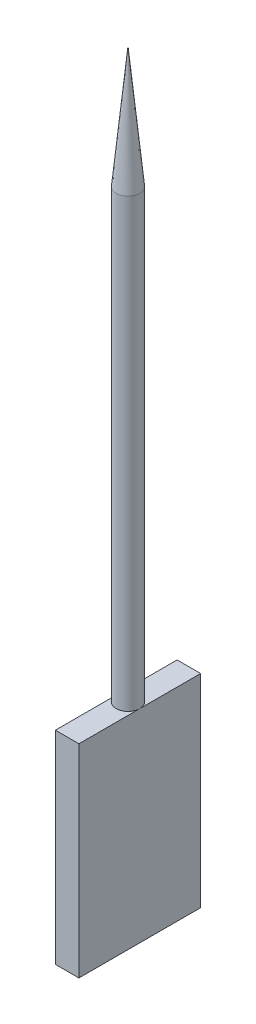
ISO-10303-21;
HEADER;
FILE_DESCRIPTION(('STEP AP214'),'2;1');
FILE_NAME('part.step','',(''),(''),'','','');
FILE_SCHEMA(('AUTOMOTIVE_DESIGN { 1 0 10303 214 1 1 1 1 }'));
ENDSEC;
DATA;
#1=APPLICATION_CONTEXT('core data for automotive mechanical design processes');
#2=APPLICATION_PROTOCOL_DEFINITION('international standard','automotive_design',2000,#1);
#3=PRODUCT_CONTEXT('',#1,'mechanical');
#4=PRODUCT('Part','Part','',(#3));
#5=PRODUCT_RELATED_PRODUCT_CATEGORY('part','',(#4));
#6=PRODUCT_DEFINITION_FORMATION('','',#4);
#7=PRODUCT_DEFINITION_CONTEXT('part definition',#1,'design');
#8=PRODUCT_DEFINITION('design','',#6,#7);
#9=PRODUCT_DEFINITION_SHAPE('','',#8);
#10=(LENGTH_UNIT() NAMED_UNIT(*) SI_UNIT(.MILLI.,.METRE.));
#11=(NAMED_UNIT(*) PLANE_ANGLE_UNIT() SI_UNIT($,.RADIAN.));
#12=(NAMED_UNIT(*) SI_UNIT($,.STERADIAN.) SOLID_ANGLE_UNIT());
#13=UNCERTAINTY_MEASURE_WITH_UNIT(LENGTH_MEASURE(1.E-05),#10,'distance_accuracy_value','');
#14=(GEOMETRIC_REPRESENTATION_CONTEXT(3) GLOBAL_UNCERTAINTY_ASSIGNED_CONTEXT((#13)) GLOBAL_UNIT_ASSIGNED_CONTEXT((#10,
#11,#12)) REPRESENTATION_CONTEXT('',''));
#15=CARTESIAN_POINT('',(0.,0.,0.));
#16=DIRECTION('',(0.,0.,1.));
#17=DIRECTION('',(1.,0.,0.));
#18=AXIS2_PLACEMENT_3D('',#15,#16,#17);
#19=CARTESIAN_POINT('',(-1.45,80.,7.5));
#20=DIRECTION('',(1.,0.,0.));
#21=DIRECTION('',(0.,0.,-1.));
#22=AXIS2_PLACEMENT_3D('',#19,#20,#21);
#23=PLANE('',#22);
#24=DIRECTION('',(0.,0.,-1.));
#25=VECTOR('',#24,1.);
#26=CARTESIAN_POINT('',(-1.45,25.,7.5));
#27=LINE('',#26,#25);
#28=CARTESIAN_POINT('',(-1.45000000000001,25.,7.5));
#29=VERTEX_POINT('',#28);
#30=CARTESIAN_POINT('',(-1.45,25.,0.));
#31=VERTEX_POINT('',#30);
#32=EDGE_CURVE('E133',#29,#31,#27,.T.);
#33=ORIENTED_EDGE('',*,*,#32,.T.);
#34=DIRECTION('',(0.,0.,-1.));
#35=VECTOR('',#34,1.);
#36=CARTESIAN_POINT('',(-1.45,25.,7.49999999999997));
#37=LINE('',#36,#35);
#38=CARTESIAN_POINT('',(-1.45000000000001,25.,-7.50000000000001));
#39=VERTEX_POINT('',#38);
#40=EDGE_CURVE('E12',#31,#39,#37,.T.);
#41=ORIENTED_EDGE('',*,*,#40,.T.);
#42=DIRECTION('',(0.,-1.,0.));
#43=VECTOR('',#42,1.);
#44=CARTESIAN_POINT('',(-1.45,80.,-7.5));
#45=LINE('',#44,#43);
#46=CARTESIAN_POINT('',(-1.45,0.,-7.5));
#47=VERTEX_POINT('',#46);
#48=EDGE_CURVE('E116',#39,#47,#45,.T.);
#49=ORIENTED_EDGE('',*,*,#48,.T.);
#50=DIRECTION('',(0.,0.,1.));
#51=VECTOR('',#50,1.);
#52=CARTESIAN_POINT('',(-1.45,0.,7.5));
#53=LINE('',#52,#51);
#54=CARTESIAN_POINT('',(-1.45,0.,7.5));
#55=VERTEX_POINT('',#54);
#56=EDGE_CURVE('E128',#47,#55,#53,.T.);
#57=ORIENTED_EDGE('',*,*,#56,.T.);
#58=DIRECTION('',(0.,-1.,0.));
#59=VECTOR('',#58,1.);
#60=CARTESIAN_POINT('',(-1.45,80.,7.5));
#61=LINE('',#60,#59);
#62=EDGE_CURVE('E56',#29,#55,#61,.T.);
#63=ORIENTED_EDGE('',*,*,#62,.F.);
#64=EDGE_LOOP('',(#33,#41,#49,#57,#63));
#65=FACE_BOUND('',#64,.T.);
#66=ADVANCED_FACE('F34',(#65),#23,.F.);
#67=CARTESIAN_POINT('',(1.45,80.,7.5));
#68=DIRECTION('',(-1.,0.,0.));
#69=DIRECTION('',(0.,0.,1.));
#70=AXIS2_PLACEMENT_3D('',#67,#68,#69);
#71=PLANE('',#70);
#72=DIRECTION('',(0.,0.,-1.));
#73=VECTOR('',#72,1.);
#74=CARTESIAN_POINT('',(1.45,25.,-1.50000000000001));
#75=LINE('',#74,#73);
#76=CARTESIAN_POINT('',(1.45,25.,0.));
#77=VERTEX_POINT('',#76);
#78=CARTESIAN_POINT('',(1.45,25.,-7.50000000000001));
#79=VERTEX_POINT('',#78);
#80=EDGE_CURVE('E138',#77,#79,#75,.T.);
#81=ORIENTED_EDGE('',*,*,#80,.F.);
#82=DIRECTION('',(0.,0.,-1.));
#83=VECTOR('',#82,1.);
#84=CARTESIAN_POINT('',(1.45,25.,1.49999999999999));
#85=LINE('',#84,#83);
#86=CARTESIAN_POINT('',(1.45,25.,7.5));
#87=VERTEX_POINT('',#86);
#88=EDGE_CURVE('E137',#87,#77,#85,.T.);
#89=ORIENTED_EDGE('',*,*,#88,.F.);
#90=DIRECTION('',(0.,-1.,0.));
#91=VECTOR('',#90,1.);
#92=CARTESIAN_POINT('',(1.45,80.,7.5));
#93=LINE('',#92,#91);
#94=CARTESIAN_POINT('',(1.45,0.,7.5));
#95=VERTEX_POINT('',#94);
#96=EDGE_CURVE('E49',#87,#95,#93,.T.);
#97=ORIENTED_EDGE('',*,*,#96,.T.);
#98=DIRECTION('',(0.,0.,-1.));
#99=VECTOR('',#98,1.);
#100=CARTESIAN_POINT('',(1.45,0.,7.5));
#101=LINE('',#100,#99);
#102=CARTESIAN_POINT('',(1.45,0.,-7.5));
#103=VERTEX_POINT('',#102);
#104=EDGE_CURVE('E131',#95,#103,#101,.T.);
#105=ORIENTED_EDGE('',*,*,#104,.T.);
#106=DIRECTION('',(0.,-1.,0.));
#107=VECTOR('',#106,1.);
#108=CARTESIAN_POINT('',(1.45,80.,-7.5));
#109=LINE('',#108,#107);
#110=EDGE_CURVE('E42',#79,#103,#109,.T.);
#111=ORIENTED_EDGE('',*,*,#110,.F.);
#112=EDGE_LOOP('',(#81,#89,#97,#105,#111));
#113=FACE_BOUND('',#112,.T.);
#114=ADVANCED_FACE('F36',(#113),#71,.F.);
#115=CARTESIAN_POINT('',(-1.45,80.,-7.5));
#116=DIRECTION('',(0.,0.,1.));
#117=DIRECTION('',(1.,0.,0.));
#118=AXIS2_PLACEMENT_3D('',#115,#116,#117);
#119=PLANE('',#118);
#120=ORIENTED_EDGE('',*,*,#48,.F.);
#121=DIRECTION('',(1.,0.,0.));
#122=VECTOR('',#121,1.);
#123=CARTESIAN_POINT('',(-78.55,25.,-7.50000000000001));
#124=LINE('',#123,#122);
#125=EDGE_CURVE('E117',#39,#79,#124,.T.);
#126=ORIENTED_EDGE('',*,*,#125,.T.);
#127=ORIENTED_EDGE('',*,*,#110,.T.);
#128=DIRECTION('',(-1.,0.,0.));
#129=VECTOR('',#128,1.);
#130=CARTESIAN_POINT('',(-1.45,0.,-7.5));
#131=LINE('',#130,#129);
#132=EDGE_CURVE('E120',#103,#47,#131,.T.);
#133=ORIENTED_EDGE('',*,*,#132,.T.);
#134=EDGE_LOOP('',(#120,#126,#127,#133));
#135=FACE_BOUND('',#134,.T.);
#136=ADVANCED_FACE('F103',(#135),#119,.F.);
#137=CARTESIAN_POINT('',(-1.45,80.,7.5));
#138=DIRECTION('',(0.,0.,-1.));
#139=DIRECTION('',(-1.,0.,0.));
#140=AXIS2_PLACEMENT_3D('',#137,#138,#139);
#141=PLANE('',#140);
#142=ORIENTED_EDGE('',*,*,#96,.F.);
#143=DIRECTION('',(1.,0.,0.));
#144=VECTOR('',#143,1.);
#145=CARTESIAN_POINT('',(-78.55,25.,7.5));
#146=LINE('',#145,#144);
#147=EDGE_CURVE('E135',#29,#87,#146,.T.);
#148=ORIENTED_EDGE('',*,*,#147,.F.);
#149=ORIENTED_EDGE('',*,*,#62,.T.);
#150=DIRECTION('',(1.,0.,0.));
#151=VECTOR('',#150,1.);
#152=CARTESIAN_POINT('',(-1.45,0.,7.5));
#153=LINE('',#152,#151);
#154=EDGE_CURVE('E126',#55,#95,#153,.T.);
#155=ORIENTED_EDGE('',*,*,#154,.T.);
#156=EDGE_LOOP('',(#142,#148,#149,#155));
#157=FACE_BOUND('',#156,.T.);
#158=ADVANCED_FACE('F105',(#157),#141,.F.);
#159=CARTESIAN_POINT('',(0.,0.,0.));
#160=DIRECTION('',(0.,-1.,0.));
#161=DIRECTION('',(0.,0.,-1.));
#162=AXIS2_PLACEMENT_3D('',#159,#160,#161);
#163=PLANE('',#162);
#164=ORIENTED_EDGE('',*,*,#104,.F.);
#165=ORIENTED_EDGE('',*,*,#154,.F.);
#166=ORIENTED_EDGE('',*,*,#56,.F.);
#167=ORIENTED_EDGE('',*,*,#132,.F.);
#168=EDGE_LOOP('',(#164,#165,#166,#167));
#169=FACE_BOUND('',#168,.T.);
#170=ADVANCED_FACE('F112',(#169),#163,.T.);
#171=CARTESIAN_POINT('',(-78.55,25.,-1.50000000000001));
#172=DIRECTION('',(0.,-1.,0.));
#173=DIRECTION('',(0.,0.,-1.));
#174=AXIS2_PLACEMENT_3D('',#171,#172,#173);
#175=PLANE('',#174);
#176=ORIENTED_EDGE('',*,*,#40,.F.);
#177=CARTESIAN_POINT('',(0.,25.,0.));
#178=DIRECTION('',(0.,1.,0.));
#179=DIRECTION('',(0.,0.,1.));
#180=AXIS2_PLACEMENT_3D('',#177,#178,#179);
#181=CIRCLE('',#180,1.45);
#182=EDGE_CURVE('E140',#77,#31,#181,.T.);
#183=ORIENTED_EDGE('',*,*,#182,.F.);
#184=ORIENTED_EDGE('',*,*,#80,.T.);
#185=ORIENTED_EDGE('',*,*,#125,.F.);
#186=EDGE_LOOP('',(#176,#183,#184,#185));
#187=FACE_BOUND('',#186,.T.);
#188=ADVANCED_FACE('F156',(#187),#175,.F.);
#189=CARTESIAN_POINT('',(-78.55,25.,1.49999999999999));
#190=DIRECTION('',(0.,-1.,0.));
#191=DIRECTION('',(0.,0.,-1.));
#192=AXIS2_PLACEMENT_3D('',#189,#190,#191);
#193=PLANE('',#192);
#194=ORIENTED_EDGE('',*,*,#147,.T.);
#195=ORIENTED_EDGE('',*,*,#88,.T.);
#196=CARTESIAN_POINT('',(0.,25.,0.));
#197=DIRECTION('',(0.,1.,0.));
#198=DIRECTION('',(0.,0.,1.));
#199=AXIS2_PLACEMENT_3D('',#196,#197,#198);
#200=CIRCLE('',#199,1.45);
#201=EDGE_CURVE('E145',#31,#77,#200,.T.);
#202=ORIENTED_EDGE('',*,*,#201,.F.);
#203=ORIENTED_EDGE('',*,*,#32,.F.);
#204=EDGE_LOOP('',(#194,#195,#202,#203));
#205=FACE_BOUND('',#204,.T.);
#206=ADVANCED_FACE('F93',(#205),#193,.F.);
#207=CARTESIAN_POINT('',(0.,25.,0.));
#208=DIRECTION('',(0.,1.,0.));
#209=DIRECTION('',(0.,0.,1.));
#210=AXIS2_PLACEMENT_3D('',#207,#208,#209);
#211=CYLINDRICAL_SURFACE('',#210,1.45);
#212=CARTESIAN_POINT('',(0.,80.,0.));
#213=DIRECTION('',(0.,1.,0.));
#214=DIRECTION('',(0.,0.,1.));
#215=AXIS2_PLACEMENT_3D('',#212,#213,#214);
#216=CIRCLE('',#215,1.45);
#217=CARTESIAN_POINT('',(0.,80.,1.45));
#218=VERTEX_POINT('',#217);
#219=EDGE_CURVE('E143',#218,#218,#216,.T.);
#220=ORIENTED_EDGE('',*,*,#219,.F.);
#221=EDGE_LOOP('',(#220));
#222=FACE_BOUND('',#221,.T.);
#223=ORIENTED_EDGE('',*,*,#201,.T.);
#224=ORIENTED_EDGE('',*,*,#182,.T.);
#225=EDGE_LOOP('',(#223,#224));
#226=FACE_BOUND('',#225,.T.);
#227=ADVANCED_FACE('F87',(#222,#226),#211,.T.);
#228=CARTESIAN_POINT('',(0.,95.,0.));
#229=DIRECTION('',(0.,-1.,0.));
#230=DIRECTION('',(0.,0.,-1.));
#231=AXIS2_PLACEMENT_3D('',#228,#229,#230);
#232=CONICAL_SURFACE('',#231,0.,0.0963672448751172);
#233=ORIENTED_EDGE('',*,*,#219,.T.);
#234=EDGE_LOOP('',(#233));
#235=FACE_BOUND('',#234,.T.);
#236=CARTESIAN_POINT('',(0.,95.,0.));
#237=VERTEX_POINT('',#236);
#238=VERTEX_LOOP('',#237);
#239=FACE_BOUND('',#238,.T.);
#240=ADVANCED_FACE('F85',(#235,#239),#232,.T.);
#241=CLOSED_SHELL('',(#66,#114,#136,#158,#170,#188,#206,#227,#240));
#242=MANIFOLD_SOLID_BREP('B2',#241);
#243=ADVANCED_BREP_SHAPE_REPRESENTATION('',(#18,#242),#14);
#244=SHAPE_DEFINITION_REPRESENTATION(#9,#243);
ENDSEC;
END-ISO-10303-21;
